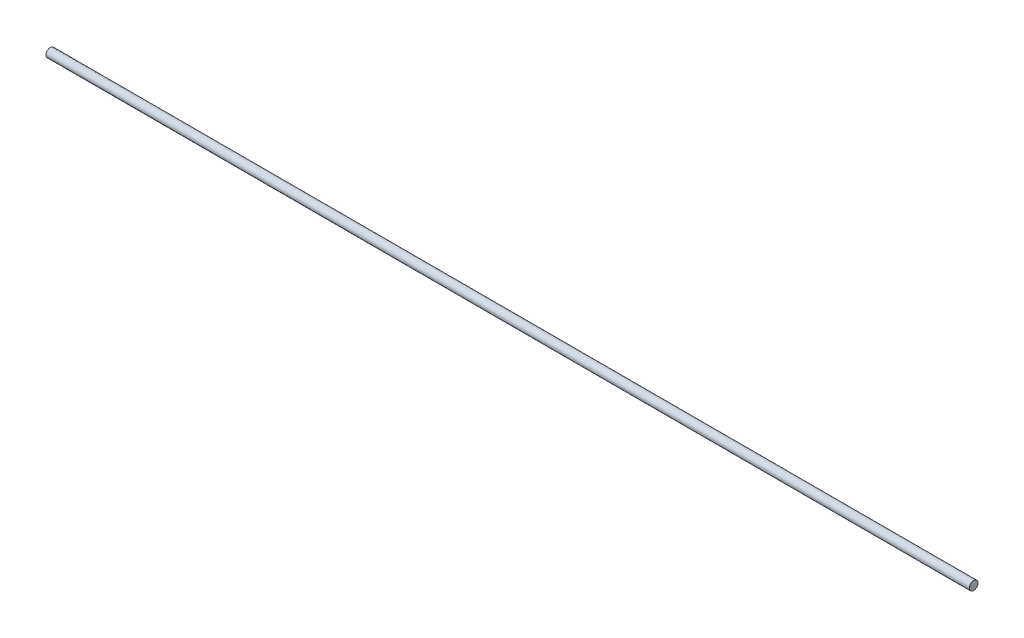
ISO-10303-21;
HEADER;
FILE_DESCRIPTION(('STEP AP214'),'2;1');
FILE_NAME('part.step','',(''),(''),'','','');
FILE_SCHEMA(('AUTOMOTIVE_DESIGN { 1 0 10303 214 1 1 1 1 }'));
ENDSEC;
DATA;
#1=APPLICATION_CONTEXT('core data for automotive mechanical design processes');
#2=APPLICATION_PROTOCOL_DEFINITION('international standard','automotive_design',2000,#1);
#3=PRODUCT_CONTEXT('',#1,'mechanical');
#4=PRODUCT('Part','Part','',(#3));
#5=PRODUCT_RELATED_PRODUCT_CATEGORY('part','',(#4));
#6=PRODUCT_DEFINITION_FORMATION('','',#4);
#7=PRODUCT_DEFINITION_CONTEXT('part definition',#1,'design');
#8=PRODUCT_DEFINITION('design','',#6,#7);
#9=PRODUCT_DEFINITION_SHAPE('','',#8);
#10=(LENGTH_UNIT() NAMED_UNIT(*) SI_UNIT(.MILLI.,.METRE.));
#11=(NAMED_UNIT(*) PLANE_ANGLE_UNIT() SI_UNIT($,.RADIAN.));
#12=(NAMED_UNIT(*) SI_UNIT($,.STERADIAN.) SOLID_ANGLE_UNIT());
#13=UNCERTAINTY_MEASURE_WITH_UNIT(LENGTH_MEASURE(1.E-05),#10,'distance_accuracy_value','');
#14=(GEOMETRIC_REPRESENTATION_CONTEXT(3) GLOBAL_UNCERTAINTY_ASSIGNED_CONTEXT((#13)) GLOBAL_UNIT_ASSIGNED_CONTEXT((#10,
#11,#12)) REPRESENTATION_CONTEXT('',''));
#15=CARTESIAN_POINT('',(0.,0.,0.));
#16=DIRECTION('',(0.,0.,1.));
#17=DIRECTION('',(1.,0.,0.));
#18=AXIS2_PLACEMENT_3D('',#15,#16,#17);
#19=CARTESIAN_POINT('',(1346.454,0.,0.));
#20=DIRECTION('',(-1.,0.,0.));
#21=DIRECTION('',(0.,0.,1.));
#22=AXIS2_PLACEMENT_3D('',#19,#20,#21);
#23=CYLINDRICAL_SURFACE('',#22,6.35);
#24=CARTESIAN_POINT('',(1346.454,0.,0.));
#25=DIRECTION('',(1.,0.,0.));
#26=DIRECTION('',(0.,0.,-1.));
#27=AXIS2_PLACEMENT_3D('',#24,#25,#26);
#28=CIRCLE('',#27,6.35);
#29=CARTESIAN_POINT('',(1346.454,0.,-6.35));
#30=VERTEX_POINT('',#29);
#31=EDGE_CURVE('E10',#30,#30,#28,.T.);
#32=ORIENTED_EDGE('',*,*,#31,.F.);
#33=EDGE_LOOP('',(#32));
#34=FACE_BOUND('',#33,.T.);
#35=CARTESIAN_POINT('',(0.,0.,0.));
#36=DIRECTION('',(1.,0.,0.));
#37=DIRECTION('',(0.,0.,-1.));
#38=AXIS2_PLACEMENT_3D('',#35,#36,#37);
#39=CIRCLE('',#38,6.35);
#40=CARTESIAN_POINT('',(0.,0.,-6.35));
#41=VERTEX_POINT('',#40);
#42=EDGE_CURVE('E44',#41,#41,#39,.T.);
#43=ORIENTED_EDGE('',*,*,#42,.T.);
#44=EDGE_LOOP('',(#43));
#45=FACE_BOUND('',#44,.T.);
#46=ADVANCED_FACE('F45',(#34,#45),#23,.T.);
#47=CARTESIAN_POINT('',(1346.454,0.,0.));
#48=DIRECTION('',(1.,0.,0.));
#49=DIRECTION('',(0.,0.,-1.));
#50=AXIS2_PLACEMENT_3D('',#47,#48,#49);
#51=PLANE('',#50);
#52=ORIENTED_EDGE('',*,*,#31,.T.);
#53=EDGE_LOOP('',(#52));
#54=FACE_BOUND('',#53,.T.);
#55=ADVANCED_FACE('F60',(#54),#51,.T.);
#56=CARTESIAN_POINT('',(0.,0.,0.));
#57=DIRECTION('',(1.,0.,0.));
#58=DIRECTION('',(0.,0.,-1.));
#59=AXIS2_PLACEMENT_3D('',#56,#57,#58);
#60=PLANE('',#59);
#61=ORIENTED_EDGE('',*,*,#42,.F.);
#62=EDGE_LOOP('',(#61));
#63=FACE_BOUND('',#62,.T.);
#64=ADVANCED_FACE('F54',(#63),#60,.F.);
#65=CLOSED_SHELL('',(#46,#55,#64));
#66=MANIFOLD_SOLID_BREP('B2',#65);
#67=ADVANCED_BREP_SHAPE_REPRESENTATION('',(#18,#66),#14);
#68=SHAPE_DEFINITION_REPRESENTATION(#9,#67);
ENDSEC;
END-ISO-10303-21;
